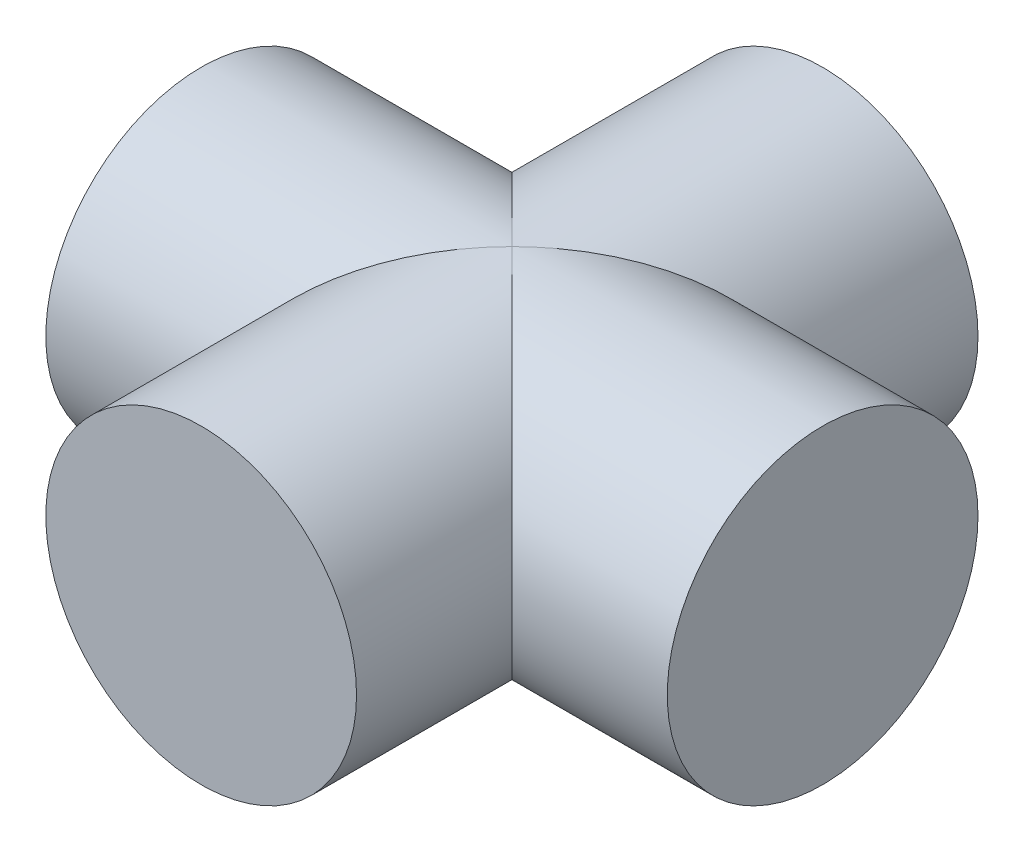
ISO-10303-21;
HEADER;
FILE_DESCRIPTION(('STEP AP214'),'2;1');
FILE_NAME('part.step','',(''),(''),'','','');
FILE_SCHEMA(('AUTOMOTIVE_DESIGN { 1 0 10303 214 1 1 1 1 }'));
ENDSEC;
DATA;
#1=APPLICATION_CONTEXT('core data for automotive mechanical design processes');
#2=APPLICATION_PROTOCOL_DEFINITION('international standard','automotive_design',2000,#1);
#3=PRODUCT_CONTEXT('',#1,'mechanical');
#4=PRODUCT('Part','Part','',(#3));
#5=PRODUCT_RELATED_PRODUCT_CATEGORY('part','',(#4));
#6=PRODUCT_DEFINITION_FORMATION('','',#4);
#7=PRODUCT_DEFINITION_CONTEXT('part definition',#1,'design');
#8=PRODUCT_DEFINITION('design','',#6,#7);
#9=PRODUCT_DEFINITION_SHAPE('','',#8);
#10=(LENGTH_UNIT() NAMED_UNIT(*) SI_UNIT(.MILLI.,.METRE.));
#11=(NAMED_UNIT(*) PLANE_ANGLE_UNIT() SI_UNIT($,.RADIAN.));
#12=(NAMED_UNIT(*) SI_UNIT($,.STERADIAN.) SOLID_ANGLE_UNIT());
#13=UNCERTAINTY_MEASURE_WITH_UNIT(LENGTH_MEASURE(1.E-05),#10,'distance_accuracy_value','');
#14=(GEOMETRIC_REPRESENTATION_CONTEXT(3) GLOBAL_UNCERTAINTY_ASSIGNED_CONTEXT((#13)) GLOBAL_UNIT_ASSIGNED_CONTEXT((#10,
#11,#12)) REPRESENTATION_CONTEXT('',''));
#15=CARTESIAN_POINT('',(0.,0.,0.));
#16=DIRECTION('',(0.,0.,1.));
#17=DIRECTION('',(1.,0.,0.));
#18=AXIS2_PLACEMENT_3D('',#15,#16,#17);
#19=CARTESIAN_POINT('',(0.,0.,-10.));
#20=DIRECTION('',(0.,0.,1.));
#21=DIRECTION('',(1.,0.,0.));
#22=AXIS2_PLACEMENT_3D('',#19,#20,#21);
#23=CYLINDRICAL_SURFACE('',#22,5.);
#24=CARTESIAN_POINT('',(0.,0.,0.));
#25=DIRECTION('',(0.707106781186547,0.,0.707106781186547));
#26=DIRECTION('',(-0.707106781186547,0.,0.707106781186547));
#27=AXIS2_PLACEMENT_3D('',#24,#25,#26);
#28=ELLIPSE('',#27,7.07106781186547,5.);
#29=CARTESIAN_POINT('',(0.,-5.,0.));
#30=VERTEX_POINT('',#29);
#31=CARTESIAN_POINT('',(0.,5.,0.));
#32=VERTEX_POINT('',#31);
#33=EDGE_CURVE('E47',#30,#32,#28,.T.);
#34=ORIENTED_EDGE('',*,*,#33,.F.);
#35=CARTESIAN_POINT('',(0.,0.,0.));
#36=DIRECTION('',(-0.707106781186547,0.,0.707106781186547));
#37=DIRECTION('',(0.707106781186547,0.,0.707106781186547));
#38=AXIS2_PLACEMENT_3D('',#35,#36,#37);
#39=ELLIPSE('',#38,7.07106781186547,5.);
#40=EDGE_CURVE('E59',#32,#30,#39,.T.);
#41=ORIENTED_EDGE('',*,*,#40,.F.);
#42=EDGE_LOOP('',(#34,#41));
#43=FACE_BOUND('',#42,.T.);
#44=CARTESIAN_POINT('',(0.,0.,-10.));
#45=DIRECTION('',(0.,0.,1.));
#46=DIRECTION('',(1.,0.,0.));
#47=AXIS2_PLACEMENT_3D('',#44,#45,#46);
#48=CIRCLE('',#47,5.);
#49=CARTESIAN_POINT('',(5.,0.,-10.));
#50=VERTEX_POINT('',#49);
#51=EDGE_CURVE('E68',#50,#50,#48,.T.);
#52=ORIENTED_EDGE('',*,*,#51,.T.);
#53=EDGE_LOOP('',(#52));
#54=FACE_BOUND('',#53,.T.);
#55=ADVANCED_FACE('F39',(#43,#54),#23,.T.);
#56=CARTESIAN_POINT('',(0.,0.,-10.));
#57=DIRECTION('',(0.,0.,1.));
#58=DIRECTION('',(1.,0.,0.));
#59=AXIS2_PLACEMENT_3D('',#56,#57,#58);
#60=PLANE('',#59);
#61=ORIENTED_EDGE('',*,*,#51,.F.);
#62=EDGE_LOOP('',(#61));
#63=FACE_BOUND('',#62,.T.);
#64=ADVANCED_FACE('F96',(#63),#60,.F.);
#65=CARTESIAN_POINT('',(10.,0.,0.));
#66=DIRECTION('',(1.,0.,0.));
#67=DIRECTION('',(0.,0.,-1.));
#68=AXIS2_PLACEMENT_3D('',#65,#66,#67);
#69=PLANE('',#68);
#70=CARTESIAN_POINT('',(10.,0.,0.));
#71=DIRECTION('',(1.,0.,0.));
#72=DIRECTION('',(0.,0.,-1.));
#73=AXIS2_PLACEMENT_3D('',#70,#71,#72);
#74=CIRCLE('',#73,5.);
#75=CARTESIAN_POINT('',(10.,0.,-5.));
#76=VERTEX_POINT('',#75);
#77=EDGE_CURVE('E83',#76,#76,#74,.T.);
#78=ORIENTED_EDGE('',*,*,#77,.T.);
#79=EDGE_LOOP('',(#78));
#80=FACE_BOUND('',#79,.T.);
#81=ADVANCED_FACE('F98',(#80),#69,.T.);
#82=CARTESIAN_POINT('',(-10.,0.,0.));
#83=DIRECTION('',(1.,0.,0.));
#84=DIRECTION('',(0.,0.,-1.));
#85=AXIS2_PLACEMENT_3D('',#82,#83,#84);
#86=CYLINDRICAL_SURFACE('',#85,5.);
#87=ORIENTED_EDGE('',*,*,#77,.F.);
#88=EDGE_LOOP('',(#87));
#89=FACE_BOUND('',#88,.T.);
#90=CARTESIAN_POINT('',(0.,0.,0.));
#91=DIRECTION('',(-0.707106781186547,0.,0.707106781186547));
#92=DIRECTION('',(0.707106781186547,0.,0.707106781186547));
#93=AXIS2_PLACEMENT_3D('',#90,#91,#92);
#94=ELLIPSE('',#93,7.07106781186547,5.);
#95=EDGE_CURVE('E53',#32,#30,#94,.F.);
#96=ORIENTED_EDGE('',*,*,#95,.T.);
#97=ORIENTED_EDGE('',*,*,#33,.T.);
#98=EDGE_LOOP('',(#96,#97));
#99=FACE_BOUND('',#98,.T.);
#100=ADVANCED_FACE('F70',(#89,#99),#86,.T.);
#101=CARTESIAN_POINT('',(0.,0.,10.));
#102=DIRECTION('',(0.,0.,1.));
#103=DIRECTION('',(1.,0.,0.));
#104=AXIS2_PLACEMENT_3D('',#101,#102,#103);
#105=PLANE('',#104);
#106=CARTESIAN_POINT('',(0.,0.,10.));
#107=DIRECTION('',(0.,0.,1.));
#108=DIRECTION('',(1.,0.,0.));
#109=AXIS2_PLACEMENT_3D('',#106,#107,#108);
#110=CIRCLE('',#109,5.);
#111=CARTESIAN_POINT('',(5.,0.,10.));
#112=VERTEX_POINT('',#111);
#113=EDGE_CURVE('E82',#112,#112,#110,.T.);
#114=ORIENTED_EDGE('',*,*,#113,.T.);
#115=EDGE_LOOP('',(#114));
#116=FACE_BOUND('',#115,.T.);
#117=ADVANCED_FACE('F106',(#116),#105,.T.);
#118=CARTESIAN_POINT('',(0.,0.,0.));
#119=DIRECTION('',(0.707106781186547,0.,0.707106781186547));
#120=DIRECTION('',(-0.707106781186547,0.,0.707106781186547));
#121=AXIS2_PLACEMENT_3D('',#118,#119,#120);
#122=ELLIPSE('',#121,7.07106781186547,5.);
#123=EDGE_CURVE('E11',#30,#32,#122,.F.);
#124=ORIENTED_EDGE('',*,*,#123,.F.);
#125=ORIENTED_EDGE('',*,*,#95,.F.);
#126=EDGE_LOOP('',(#124,#125));
#127=FACE_BOUND('',#126,.T.);
#128=ORIENTED_EDGE('',*,*,#113,.F.);
#129=EDGE_LOOP('',(#128));
#130=FACE_BOUND('',#129,.T.);
#131=ADVANCED_FACE('F65',(#127,#130),#23,.T.);
#132=ORIENTED_EDGE('',*,*,#40,.T.);
#133=ORIENTED_EDGE('',*,*,#123,.T.);
#134=EDGE_LOOP('',(#132,#133));
#135=FACE_BOUND('',#134,.T.);
#136=CARTESIAN_POINT('',(-10.,0.,0.));
#137=DIRECTION('',(1.,0.,0.));
#138=DIRECTION('',(0.,0.,-1.));
#139=AXIS2_PLACEMENT_3D('',#136,#137,#138);
#140=CIRCLE('',#139,5.);
#141=CARTESIAN_POINT('',(-10.,0.,-5.));
#142=VERTEX_POINT('',#141);
#143=EDGE_CURVE('E79',#142,#142,#140,.T.);
#144=ORIENTED_EDGE('',*,*,#143,.T.);
#145=EDGE_LOOP('',(#144));
#146=FACE_BOUND('',#145,.T.);
#147=ADVANCED_FACE('F72',(#135,#146),#86,.T.);
#148=CARTESIAN_POINT('',(-10.,0.,0.));
#149=DIRECTION('',(1.,0.,0.));
#150=DIRECTION('',(0.,0.,-1.));
#151=AXIS2_PLACEMENT_3D('',#148,#149,#150);
#152=PLANE('',#151);
#153=ORIENTED_EDGE('',*,*,#143,.F.);
#154=EDGE_LOOP('',(#153));
#155=FACE_BOUND('',#154,.T.);
#156=ADVANCED_FACE('F75',(#155),#152,.F.);
#157=CLOSED_SHELL('',(#55,#64,#81,#100,#117,#131,#147,#156));
#158=MANIFOLD_SOLID_BREP('B2',#157);
#159=ADVANCED_BREP_SHAPE_REPRESENTATION('',(#18,#158),#14);
#160=SHAPE_DEFINITION_REPRESENTATION(#9,#159);
ENDSEC;
END-ISO-10303-21;
